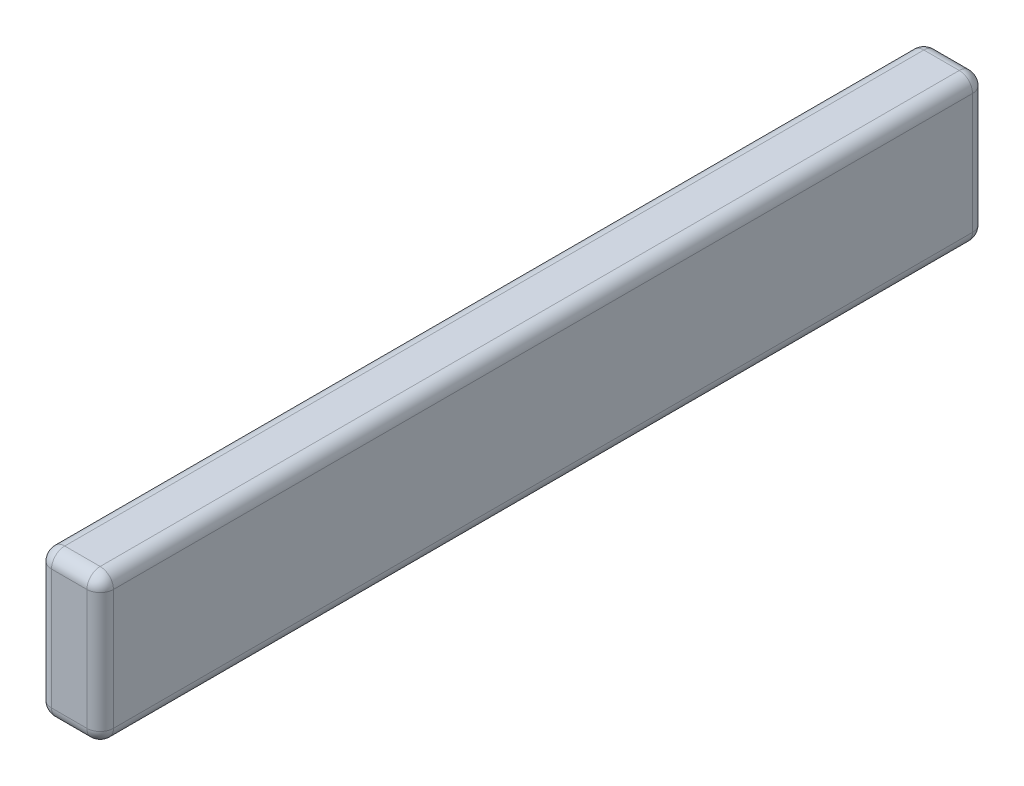
ISO-10303-21;
HEADER;
FILE_DESCRIPTION(('STEP AP214'),'2;1');
FILE_NAME('part.step','',(''),(''),'','','');
FILE_SCHEMA(('AUTOMOTIVE_DESIGN { 1 0 10303 214 1 1 1 1 }'));
ENDSEC;
DATA;
#1=APPLICATION_CONTEXT('core data for automotive mechanical design processes');
#2=APPLICATION_PROTOCOL_DEFINITION('international standard','automotive_design',2000,#1);
#3=PRODUCT_CONTEXT('',#1,'mechanical');
#4=PRODUCT('Part','Part','',(#3));
#5=PRODUCT_RELATED_PRODUCT_CATEGORY('part','',(#4));
#6=PRODUCT_DEFINITION_FORMATION('','',#4);
#7=PRODUCT_DEFINITION_CONTEXT('part definition',#1,'design');
#8=PRODUCT_DEFINITION('design','',#6,#7);
#9=PRODUCT_DEFINITION_SHAPE('','',#8);
#10=(LENGTH_UNIT() NAMED_UNIT(*) SI_UNIT(.MILLI.,.METRE.));
#11=(NAMED_UNIT(*) PLANE_ANGLE_UNIT() SI_UNIT($,.RADIAN.));
#12=(NAMED_UNIT(*) SI_UNIT($,.STERADIAN.) SOLID_ANGLE_UNIT());
#13=UNCERTAINTY_MEASURE_WITH_UNIT(LENGTH_MEASURE(1.E-05),#10,'distance_accuracy_value','');
#14=(GEOMETRIC_REPRESENTATION_CONTEXT(3) GLOBAL_UNCERTAINTY_ASSIGNED_CONTEXT((#13)) GLOBAL_UNIT_ASSIGNED_CONTEXT((#10,
#11,#12)) REPRESENTATION_CONTEXT('',''));
#15=CARTESIAN_POINT('',(0.,0.,0.));
#16=DIRECTION('',(0.,0.,1.));
#17=DIRECTION('',(1.,0.,0.));
#18=AXIS2_PLACEMENT_3D('',#15,#16,#17);
#19=CARTESIAN_POINT('',(140.,165.8,1000.));
#20=DIRECTION('',(0.,0.,-1.));
#21=DIRECTION('',(-1.,0.,0.));
#22=AXIS2_PLACEMENT_3D('',#19,#20,#21);
#23=PLANE('',#22);
#24=DIRECTION('',(-1.,0.,0.));
#25=VECTOR('',#24,1.);
#26=CARTESIAN_POINT('',(140.,135.8,1000.));
#27=LINE('',#26,#25);
#28=CARTESIAN_POINT('',(110.,135.8,1000.));
#29=VERTEX_POINT('',#28);
#30=CARTESIAN_POINT('',(30.,135.8,1000.));
#31=VERTEX_POINT('',#30);
#32=EDGE_CURVE('E166',#29,#31,#27,.T.);
#33=ORIENTED_EDGE('',*,*,#32,.T.);
#34=DIRECTION('',(0.,-1.,0.));
#35=VECTOR('',#34,1.);
#36=CARTESIAN_POINT('',(30.,-165.8,1000.));
#37=LINE('',#36,#35);
#38=CARTESIAN_POINT('',(30.,-135.8,1000.));
#39=VERTEX_POINT('',#38);
#40=EDGE_CURVE('E171',#31,#39,#37,.T.);
#41=ORIENTED_EDGE('',*,*,#40,.T.);
#42=DIRECTION('',(-1.,0.,0.));
#43=VECTOR('',#42,1.);
#44=CARTESIAN_POINT('',(140.,-135.8,1000.));
#45=LINE('',#44,#43);
#46=CARTESIAN_POINT('',(110.,-135.8,1000.));
#47=VERTEX_POINT('',#46);
#48=EDGE_CURVE('E168',#39,#47,#45,.F.);
#49=ORIENTED_EDGE('',*,*,#48,.T.);
#50=DIRECTION('',(0.,-1.,0.));
#51=VECTOR('',#50,1.);
#52=CARTESIAN_POINT('',(110.,165.8,1000.));
#53=LINE('',#52,#51);
#54=EDGE_CURVE('E164',#47,#29,#53,.F.);
#55=ORIENTED_EDGE('',*,*,#54,.T.);
#56=EDGE_LOOP('',(#33,#41,#49,#55));
#57=FACE_BOUND('',#56,.T.);
#58=ADVANCED_FACE('F33',(#57),#23,.F.);
#59=CARTESIAN_POINT('',(140.,-165.8,-1000.));
#60=DIRECTION('',(0.,1.,0.));
#61=DIRECTION('',(0.,0.,1.));
#62=AXIS2_PLACEMENT_3D('',#59,#60,#61);
#63=PLANE('',#62);
#64=DIRECTION('',(-1.,0.,0.));
#65=VECTOR('',#64,1.);
#66=CARTESIAN_POINT('',(140.,-165.8,970.));
#67=LINE('',#66,#65);
#68=CARTESIAN_POINT('',(110.,-165.8,970.));
#69=VERTEX_POINT('',#68);
#70=CARTESIAN_POINT('',(30.,-165.8,970.));
#71=VERTEX_POINT('',#70);
#72=EDGE_CURVE('E132',#69,#71,#67,.T.);
#73=ORIENTED_EDGE('',*,*,#72,.T.);
#74=DIRECTION('',(0.,0.,-1.));
#75=VECTOR('',#74,1.);
#76=CARTESIAN_POINT('',(30.,-165.8,-1000.));
#77=LINE('',#76,#75);
#78=CARTESIAN_POINT('',(30.,-165.8,-970.));
#79=VERTEX_POINT('',#78);
#80=EDGE_CURVE('E128',#71,#79,#77,.T.);
#81=ORIENTED_EDGE('',*,*,#80,.T.);
#82=DIRECTION('',(-1.,0.,0.));
#83=VECTOR('',#82,1.);
#84=CARTESIAN_POINT('',(140.,-165.8,-970.));
#85=LINE('',#84,#83);
#86=CARTESIAN_POINT('',(110.,-165.8,-970.));
#87=VERTEX_POINT('',#86);
#88=EDGE_CURVE('E120',#79,#87,#85,.F.);
#89=ORIENTED_EDGE('',*,*,#88,.T.);
#90=DIRECTION('',(0.,0.,-1.));
#91=VECTOR('',#90,1.);
#92=CARTESIAN_POINT('',(110.,-165.8,-1000.));
#93=LINE('',#92,#91);
#94=EDGE_CURVE('E125',#87,#69,#93,.F.);
#95=ORIENTED_EDGE('',*,*,#94,.T.);
#96=EDGE_LOOP('',(#73,#81,#89,#95));
#97=FACE_BOUND('',#96,.T.);
#98=ADVANCED_FACE('F123',(#97),#63,.F.);
#99=CARTESIAN_POINT('',(140.,165.8,-1000.));
#100=DIRECTION('',(0.,0.,1.));
#101=DIRECTION('',(1.,0.,0.));
#102=AXIS2_PLACEMENT_3D('',#99,#100,#101);
#103=PLANE('',#102);
#104=DIRECTION('',(-1.,0.,0.));
#105=VECTOR('',#104,1.);
#106=CARTESIAN_POINT('',(140.,-135.8,-1000.));
#107=LINE('',#106,#105);
#108=CARTESIAN_POINT('',(110.,-135.8,-1000.));
#109=VERTEX_POINT('',#108);
#110=CARTESIAN_POINT('',(30.,-135.8,-1000.));
#111=VERTEX_POINT('',#110);
#112=EDGE_CURVE('E140',#109,#111,#107,.T.);
#113=ORIENTED_EDGE('',*,*,#112,.T.);
#114=DIRECTION('',(0.,1.,0.));
#115=VECTOR('',#114,1.);
#116=CARTESIAN_POINT('',(30.,165.8,-1000.));
#117=LINE('',#116,#115);
#118=CARTESIAN_POINT('',(30.,135.8,-1000.));
#119=VERTEX_POINT('',#118);
#120=EDGE_CURVE('E178',#111,#119,#117,.T.);
#121=ORIENTED_EDGE('',*,*,#120,.T.);
#122=DIRECTION('',(-1.,0.,0.));
#123=VECTOR('',#122,1.);
#124=CARTESIAN_POINT('',(140.,135.8,-1000.));
#125=LINE('',#124,#123);
#126=CARTESIAN_POINT('',(110.,135.8,-1000.));
#127=VERTEX_POINT('',#126);
#128=EDGE_CURVE('E175',#119,#127,#125,.F.);
#129=ORIENTED_EDGE('',*,*,#128,.T.);
#130=DIRECTION('',(0.,1.,0.));
#131=VECTOR('',#130,1.);
#132=CARTESIAN_POINT('',(110.,165.8,-1000.));
#133=LINE('',#132,#131);
#134=EDGE_CURVE('E173',#127,#109,#133,.F.);
#135=ORIENTED_EDGE('',*,*,#134,.T.);
#136=EDGE_LOOP('',(#113,#121,#129,#135));
#137=FACE_BOUND('',#136,.T.);
#138=ADVANCED_FACE('F324',(#137),#103,.F.);
#139=CARTESIAN_POINT('',(140.,165.8,-1000.));
#140=DIRECTION('',(0.,-1.,0.));
#141=DIRECTION('',(0.,0.,-1.));
#142=AXIS2_PLACEMENT_3D('',#139,#140,#141);
#143=PLANE('',#142);
#144=DIRECTION('',(-1.,0.,0.));
#145=VECTOR('',#144,1.);
#146=CARTESIAN_POINT('',(140.,165.8,-970.));
#147=LINE('',#146,#145);
#148=CARTESIAN_POINT('',(110.,165.8,-970.));
#149=VERTEX_POINT('',#148);
#150=CARTESIAN_POINT('',(30.,165.8,-970.));
#151=VERTEX_POINT('',#150);
#152=EDGE_CURVE('E184',#149,#151,#147,.T.);
#153=ORIENTED_EDGE('',*,*,#152,.T.);
#154=DIRECTION('',(0.,0.,1.));
#155=VECTOR('',#154,1.);
#156=CARTESIAN_POINT('',(30.,165.8,1000.));
#157=LINE('',#156,#155);
#158=CARTESIAN_POINT('',(30.,165.8,970.));
#159=VERTEX_POINT('',#158);
#160=EDGE_CURVE('E187',#151,#159,#157,.T.);
#161=ORIENTED_EDGE('',*,*,#160,.T.);
#162=DIRECTION('',(-1.,0.,0.));
#163=VECTOR('',#162,1.);
#164=CARTESIAN_POINT('',(140.,165.8,970.));
#165=LINE('',#164,#163);
#166=CARTESIAN_POINT('',(110.,165.8,970.));
#167=VERTEX_POINT('',#166);
#168=EDGE_CURVE('E182',#159,#167,#165,.F.);
#169=ORIENTED_EDGE('',*,*,#168,.T.);
#170=DIRECTION('',(0.,0.,1.));
#171=VECTOR('',#170,1.);
#172=CARTESIAN_POINT('',(110.,165.8,-1000.));
#173=LINE('',#172,#171);
#174=EDGE_CURVE('E180',#167,#149,#173,.F.);
#175=ORIENTED_EDGE('',*,*,#174,.T.);
#176=EDGE_LOOP('',(#153,#161,#169,#175));
#177=FACE_BOUND('',#176,.T.);
#178=ADVANCED_FACE('F273',(#177),#143,.F.);
#179=CARTESIAN_POINT('',(140.,0.,0.));
#180=DIRECTION('',(-1.,0.,0.));
#181=DIRECTION('',(0.,0.,1.));
#182=AXIS2_PLACEMENT_3D('',#179,#180,#181);
#183=PLANE('',#182);
#184=DIRECTION('',(0.,1.,0.));
#185=VECTOR('',#184,1.);
#186=CARTESIAN_POINT('',(140.,0.,-970.));
#187=LINE('',#186,#185);
#188=CARTESIAN_POINT('',(140.,-135.8,-970.));
#189=VERTEX_POINT('',#188);
#190=CARTESIAN_POINT('',(140.,135.8,-970.));
#191=VERTEX_POINT('',#190);
#192=EDGE_CURVE('E42',#189,#191,#187,.T.);
#193=ORIENTED_EDGE('',*,*,#192,.T.);
#194=DIRECTION('',(0.,0.,1.));
#195=VECTOR('',#194,1.);
#196=CARTESIAN_POINT('',(140.,135.8,0.));
#197=LINE('',#196,#195);
#198=CARTESIAN_POINT('',(140.,135.8,970.));
#199=VERTEX_POINT('',#198);
#200=EDGE_CURVE('E11',#191,#199,#197,.T.);
#201=ORIENTED_EDGE('',*,*,#200,.T.);
#202=DIRECTION('',(0.,-1.,0.));
#203=VECTOR('',#202,1.);
#204=CARTESIAN_POINT('',(140.,0.,970.));
#205=LINE('',#204,#203);
#206=CARTESIAN_POINT('',(140.,-135.8,970.));
#207=VERTEX_POINT('',#206);
#208=EDGE_CURVE('E198',#199,#207,#205,.T.);
#209=ORIENTED_EDGE('',*,*,#208,.T.);
#210=DIRECTION('',(0.,0.,-1.));
#211=VECTOR('',#210,1.);
#212=CARTESIAN_POINT('',(140.,-135.8,0.));
#213=LINE('',#212,#211);
#214=EDGE_CURVE('E53',#207,#189,#213,.T.);
#215=ORIENTED_EDGE('',*,*,#214,.T.);
#216=EDGE_LOOP('',(#193,#201,#209,#215));
#217=FACE_BOUND('',#216,.T.);
#218=ADVANCED_FACE('F288',(#217),#183,.F.);
#219=CARTESIAN_POINT('',(0.,0.,0.));
#220=DIRECTION('',(-1.,0.,0.));
#221=DIRECTION('',(0.,0.,1.));
#222=AXIS2_PLACEMENT_3D('',#219,#220,#221);
#223=PLANE('',#222);
#224=DIRECTION('',(0.,1.,0.));
#225=VECTOR('',#224,1.);
#226=CARTESIAN_POINT('',(0.,-165.8,-970.));
#227=LINE('',#226,#225);
#228=CARTESIAN_POINT('',(0.,135.8,-970.));
#229=VERTEX_POINT('',#228);
#230=CARTESIAN_POINT('',(0.,-135.8,-970.));
#231=VERTEX_POINT('',#230);
#232=EDGE_CURVE('E193',#229,#231,#227,.F.);
#233=ORIENTED_EDGE('',*,*,#232,.T.);
#234=DIRECTION('',(0.,0.,-1.));
#235=VECTOR('',#234,1.);
#236=CARTESIAN_POINT('',(0.,-135.8,1000.));
#237=LINE('',#236,#235);
#238=CARTESIAN_POINT('',(0.,-135.8,970.));
#239=VERTEX_POINT('',#238);
#240=EDGE_CURVE('E195',#231,#239,#237,.F.);
#241=ORIENTED_EDGE('',*,*,#240,.T.);
#242=DIRECTION('',(0.,-1.,0.));
#243=VECTOR('',#242,1.);
#244=CARTESIAN_POINT('',(0.,165.8,970.));
#245=LINE('',#244,#243);
#246=CARTESIAN_POINT('',(0.,135.8,970.));
#247=VERTEX_POINT('',#246);
#248=EDGE_CURVE('E189',#239,#247,#245,.F.);
#249=ORIENTED_EDGE('',*,*,#248,.T.);
#250=DIRECTION('',(0.,0.,1.));
#251=VECTOR('',#250,1.);
#252=CARTESIAN_POINT('',(0.,135.8,-1000.));
#253=LINE('',#252,#251);
#254=EDGE_CURVE('E191',#247,#229,#253,.F.);
#255=ORIENTED_EDGE('',*,*,#254,.T.);
#256=EDGE_LOOP('',(#233,#241,#249,#255));
#257=FACE_BOUND('',#256,.T.);
#258=ADVANCED_FACE('F264',(#257),#223,.T.);
#259=CARTESIAN_POINT('',(140.,135.8,-970.));
#260=DIRECTION('',(-1.,0.,0.));
#261=DIRECTION('',(0.,0.,1.));
#262=AXIS2_PLACEMENT_3D('',#259,#260,#261);
#263=CYLINDRICAL_SURFACE('',#262,30.);
#264=CARTESIAN_POINT('',(110.,135.8,-970.));
#265=DIRECTION('',(1.,0.,0.));
#266=DIRECTION('',(0.,0.,-1.));
#267=AXIS2_PLACEMENT_3D('',#264,#265,#266);
#268=CIRCLE('',#267,30.);
#269=EDGE_CURVE('E37',#127,#149,#268,.T.);
#270=ORIENTED_EDGE('',*,*,#269,.F.);
#271=ORIENTED_EDGE('',*,*,#128,.F.);
#272=CARTESIAN_POINT('',(30.,135.8,-970.));
#273=DIRECTION('',(-1.,0.,0.));
#274=DIRECTION('',(0.,0.,1.));
#275=AXIS2_PLACEMENT_3D('',#272,#273,#274);
#276=CIRCLE('',#275,30.);
#277=EDGE_CURVE('E160',#151,#119,#276,.T.);
#278=ORIENTED_EDGE('',*,*,#277,.F.);
#279=ORIENTED_EDGE('',*,*,#152,.F.);
#280=EDGE_LOOP('',(#270,#271,#278,#279));
#281=FACE_BOUND('',#280,.T.);
#282=ADVANCED_FACE('F35',(#281),#263,.T.);
#283=CARTESIAN_POINT('',(110.,135.8,-970.));
#284=DIRECTION('',(0.,0.,1.));
#285=DIRECTION('',(1.,0.,0.));
#286=AXIS2_PLACEMENT_3D('',#283,#284,#285);
#287=SPHERICAL_SURFACE('',#286,30.);
#288=CARTESIAN_POINT('',(110.,135.8,-970.));
#289=DIRECTION('',(0.,1.,0.));
#290=DIRECTION('',(0.,0.,1.));
#291=AXIS2_PLACEMENT_3D('',#288,#289,#290);
#292=CIRCLE('',#291,30.);
#293=EDGE_CURVE('E244',#127,#191,#292,.F.);
#294=ORIENTED_EDGE('',*,*,#293,.F.);
#295=ORIENTED_EDGE('',*,*,#269,.T.);
#296=CARTESIAN_POINT('',(110.,135.8,-970.));
#297=DIRECTION('',(0.,0.,-1.));
#298=DIRECTION('',(-1.,0.,0.));
#299=AXIS2_PLACEMENT_3D('',#296,#297,#298);
#300=CIRCLE('',#299,30.);
#301=EDGE_CURVE('E246',#191,#149,#300,.F.);
#302=ORIENTED_EDGE('',*,*,#301,.F.);
#303=EDGE_LOOP('',(#294,#295,#302));
#304=FACE_BOUND('',#303,.T.);
#305=ADVANCED_FACE('F457',(#304),#287,.T.);
#306=CARTESIAN_POINT('',(30.,135.8,-970.));
#307=DIRECTION('',(0.,0.,1.));
#308=DIRECTION('',(1.,0.,0.));
#309=AXIS2_PLACEMENT_3D('',#306,#307,#308);
#310=SPHERICAL_SURFACE('',#309,30.);
#311=CARTESIAN_POINT('',(30.,135.8,-970.));
#312=DIRECTION('',(0.,0.,-1.));
#313=DIRECTION('',(-1.,0.,0.));
#314=AXIS2_PLACEMENT_3D('',#311,#312,#313);
#315=CIRCLE('',#314,30.);
#316=EDGE_CURVE('E238',#151,#229,#315,.F.);
#317=ORIENTED_EDGE('',*,*,#316,.F.);
#318=ORIENTED_EDGE('',*,*,#277,.T.);
#319=CARTESIAN_POINT('',(30.,135.8,-970.));
#320=DIRECTION('',(0.,1.,0.));
#321=DIRECTION('',(0.,0.,1.));
#322=AXIS2_PLACEMENT_3D('',#319,#320,#321);
#323=CIRCLE('',#322,30.);
#324=EDGE_CURVE('E241',#229,#119,#323,.F.);
#325=ORIENTED_EDGE('',*,*,#324,.F.);
#326=EDGE_LOOP('',(#317,#318,#325));
#327=FACE_BOUND('',#326,.T.);
#328=ADVANCED_FACE('F253',(#327),#310,.T.);
#329=CARTESIAN_POINT('',(110.,135.8,0.));
#330=DIRECTION('',(0.,0.,1.));
#331=DIRECTION('',(0.,-1.,0.));
#332=AXIS2_PLACEMENT_3D('',#329,#330,#331);
#333=CYLINDRICAL_SURFACE('',#332,30.);
#334=ORIENTED_EDGE('',*,*,#301,.T.);
#335=ORIENTED_EDGE('',*,*,#174,.F.);
#336=CARTESIAN_POINT('',(110.,135.8,970.));
#337=DIRECTION('',(0.,0.,1.));
#338=DIRECTION('',(1.,0.,0.));
#339=AXIS2_PLACEMENT_3D('',#336,#337,#338);
#340=CIRCLE('',#339,30.);
#341=EDGE_CURVE('E232',#199,#167,#340,.T.);
#342=ORIENTED_EDGE('',*,*,#341,.F.);
#343=ORIENTED_EDGE('',*,*,#200,.F.);
#344=EDGE_LOOP('',(#334,#335,#342,#343));
#345=FACE_BOUND('',#344,.T.);
#346=ADVANCED_FACE('F287',(#345),#333,.T.);
#347=CARTESIAN_POINT('',(110.,0.,-970.));
#348=DIRECTION('',(0.,1.,0.));
#349=DIRECTION('',(0.,0.,1.));
#350=AXIS2_PLACEMENT_3D('',#347,#348,#349);
#351=CYLINDRICAL_SURFACE('',#350,30.);
#352=ORIENTED_EDGE('',*,*,#293,.T.);
#353=ORIENTED_EDGE('',*,*,#192,.F.);
#354=CARTESIAN_POINT('',(110.,-135.8,-970.));
#355=DIRECTION('',(0.,-1.,0.));
#356=DIRECTION('',(1.,0.,0.));
#357=AXIS2_PLACEMENT_3D('',#354,#355,#356);
#358=CIRCLE('',#357,30.);
#359=EDGE_CURVE('E144',#109,#189,#358,.T.);
#360=ORIENTED_EDGE('',*,*,#359,.F.);
#361=ORIENTED_EDGE('',*,*,#134,.F.);
#362=EDGE_LOOP('',(#352,#353,#360,#361));
#363=FACE_BOUND('',#362,.T.);
#364=ADVANCED_FACE('F434',(#363),#351,.T.);
#365=CARTESIAN_POINT('',(140.,-135.8,-970.));
#366=DIRECTION('',(-1.,0.,0.));
#367=DIRECTION('',(0.,0.,1.));
#368=AXIS2_PLACEMENT_3D('',#365,#366,#367);
#369=CYLINDRICAL_SURFACE('',#368,30.);
#370=CARTESIAN_POINT('',(30.,-135.8,-970.));
#371=DIRECTION('',(-1.,0.,0.));
#372=DIRECTION('',(0.,0.,1.));
#373=AXIS2_PLACEMENT_3D('',#370,#371,#372);
#374=CIRCLE('',#373,30.);
#375=EDGE_CURVE('E145',#111,#79,#374,.T.);
#376=ORIENTED_EDGE('',*,*,#375,.F.);
#377=ORIENTED_EDGE('',*,*,#112,.F.);
#378=CARTESIAN_POINT('',(110.,-135.8,-970.));
#379=DIRECTION('',(1.,0.,0.));
#380=DIRECTION('',(0.,0.,-1.));
#381=AXIS2_PLACEMENT_3D('',#378,#379,#380);
#382=CIRCLE('',#381,30.);
#383=EDGE_CURVE('E136',#87,#109,#382,.T.);
#384=ORIENTED_EDGE('',*,*,#383,.F.);
#385=ORIENTED_EDGE('',*,*,#88,.F.);
#386=EDGE_LOOP('',(#376,#377,#384,#385));
#387=FACE_BOUND('',#386,.T.);
#388=ADVANCED_FACE('F138',(#387),#369,.T.);
#389=CARTESIAN_POINT('',(30.,165.8,-970.));
#390=DIRECTION('',(0.,-1.,0.));
#391=DIRECTION('',(0.,0.,-1.));
#392=AXIS2_PLACEMENT_3D('',#389,#390,#391);
#393=CYLINDRICAL_SURFACE('',#392,30.);
#394=ORIENTED_EDGE('',*,*,#324,.T.);
#395=ORIENTED_EDGE('',*,*,#120,.F.);
#396=CARTESIAN_POINT('',(30.,-135.8,-970.));
#397=DIRECTION('',(0.,-1.,0.));
#398=DIRECTION('',(0.,0.,-1.));
#399=AXIS2_PLACEMENT_3D('',#396,#397,#398);
#400=CIRCLE('',#399,30.);
#401=EDGE_CURVE('E228',#231,#111,#400,.T.);
#402=ORIENTED_EDGE('',*,*,#401,.F.);
#403=ORIENTED_EDGE('',*,*,#232,.F.);
#404=EDGE_LOOP('',(#394,#395,#402,#403));
#405=FACE_BOUND('',#404,.T.);
#406=ADVANCED_FACE('F260',(#405),#393,.T.);
#407=CARTESIAN_POINT('',(30.,135.8,-1000.));
#408=DIRECTION('',(0.,0.,-1.));
#409=DIRECTION('',(0.,1.,0.));
#410=AXIS2_PLACEMENT_3D('',#407,#408,#409);
#411=CYLINDRICAL_SURFACE('',#410,30.);
#412=ORIENTED_EDGE('',*,*,#316,.T.);
#413=ORIENTED_EDGE('',*,*,#254,.F.);
#414=CARTESIAN_POINT('',(30.,135.8,970.));
#415=DIRECTION('',(0.,0.,1.));
#416=DIRECTION('',(1.,0.,0.));
#417=AXIS2_PLACEMENT_3D('',#414,#415,#416);
#418=CIRCLE('',#417,30.);
#419=EDGE_CURVE('E225',#159,#247,#418,.T.);
#420=ORIENTED_EDGE('',*,*,#419,.F.);
#421=ORIENTED_EDGE('',*,*,#160,.F.);
#422=EDGE_LOOP('',(#412,#413,#420,#421));
#423=FACE_BOUND('',#422,.T.);
#424=ADVANCED_FACE('F270',(#423),#411,.T.);
#425=CARTESIAN_POINT('',(140.,135.8,970.));
#426=DIRECTION('',(-1.,0.,0.));
#427=DIRECTION('',(0.,0.,1.));
#428=AXIS2_PLACEMENT_3D('',#425,#426,#427);
#429=CYLINDRICAL_SURFACE('',#428,30.);
#430=CARTESIAN_POINT('',(110.,135.8,970.));
#431=DIRECTION('',(1.,0.,0.));
#432=DIRECTION('',(0.,0.,-1.));
#433=AXIS2_PLACEMENT_3D('',#430,#431,#432);
#434=CIRCLE('',#433,30.);
#435=EDGE_CURVE('E235',#167,#29,#434,.T.);
#436=ORIENTED_EDGE('',*,*,#435,.F.);
#437=ORIENTED_EDGE('',*,*,#168,.F.);
#438=CARTESIAN_POINT('',(30.,135.8,970.));
#439=DIRECTION('',(-1.,0.,0.));
#440=DIRECTION('',(0.,0.,1.));
#441=AXIS2_PLACEMENT_3D('',#438,#439,#440);
#442=CIRCLE('',#441,30.);
#443=EDGE_CURVE('E222',#31,#159,#442,.T.);
#444=ORIENTED_EDGE('',*,*,#443,.F.);
#445=ORIENTED_EDGE('',*,*,#32,.F.);
#446=EDGE_LOOP('',(#436,#437,#444,#445));
#447=FACE_BOUND('',#446,.T.);
#448=ADVANCED_FACE('F278',(#447),#429,.T.);
#449=CARTESIAN_POINT('',(110.,135.8,970.));
#450=DIRECTION('',(0.,0.,1.));
#451=DIRECTION('',(1.,0.,0.));
#452=AXIS2_PLACEMENT_3D('',#449,#450,#451);
#453=SPHERICAL_SURFACE('',#452,30.);
#454=ORIENTED_EDGE('',*,*,#341,.T.);
#455=ORIENTED_EDGE('',*,*,#435,.T.);
#456=CARTESIAN_POINT('',(110.,135.8,970.));
#457=DIRECTION('',(0.,1.,0.));
#458=DIRECTION('',(0.,0.,1.));
#459=AXIS2_PLACEMENT_3D('',#456,#457,#458);
#460=CIRCLE('',#459,30.);
#461=EDGE_CURVE('E151',#199,#29,#460,.F.);
#462=ORIENTED_EDGE('',*,*,#461,.F.);
#463=EDGE_LOOP('',(#454,#455,#462));
#464=FACE_BOUND('',#463,.T.);
#465=ADVANCED_FACE('F284',(#464),#453,.T.);
#466=CARTESIAN_POINT('',(110.,-135.8,-970.));
#467=DIRECTION('',(0.,0.,1.));
#468=DIRECTION('',(1.,0.,0.));
#469=AXIS2_PLACEMENT_3D('',#466,#467,#468);
#470=SPHERICAL_SURFACE('',#469,30.);
#471=ORIENTED_EDGE('',*,*,#383,.T.);
#472=ORIENTED_EDGE('',*,*,#359,.T.);
#473=CARTESIAN_POINT('',(110.,-135.8,-970.));
#474=DIRECTION('',(0.,0.,-1.));
#475=DIRECTION('',(-1.,0.,0.));
#476=AXIS2_PLACEMENT_3D('',#473,#474,#475);
#477=CIRCLE('',#476,30.);
#478=EDGE_CURVE('E148',#87,#189,#477,.F.);
#479=ORIENTED_EDGE('',*,*,#478,.F.);
#480=EDGE_LOOP('',(#471,#472,#479));
#481=FACE_BOUND('',#480,.T.);
#482=ADVANCED_FACE('F149',(#481),#470,.T.);
#483=CARTESIAN_POINT('',(30.,-135.8,-970.));
#484=DIRECTION('',(0.,0.,1.));
#485=DIRECTION('',(1.,0.,0.));
#486=AXIS2_PLACEMENT_3D('',#483,#484,#485);
#487=SPHERICAL_SURFACE('',#486,30.);
#488=ORIENTED_EDGE('',*,*,#401,.T.);
#489=ORIENTED_EDGE('',*,*,#375,.T.);
#490=CARTESIAN_POINT('',(30.,-135.8,-970.));
#491=DIRECTION('',(0.,0.,-1.));
#492=DIRECTION('',(-1.,0.,0.));
#493=AXIS2_PLACEMENT_3D('',#490,#491,#492);
#494=CIRCLE('',#493,30.);
#495=EDGE_CURVE('E152',#231,#79,#494,.F.);
#496=ORIENTED_EDGE('',*,*,#495,.F.);
#497=EDGE_LOOP('',(#488,#489,#496));
#498=FACE_BOUND('',#497,.T.);
#499=ADVANCED_FACE('F307',(#498),#487,.T.);
#500=CARTESIAN_POINT('',(30.,135.8,970.));
#501=DIRECTION('',(0.,0.,1.));
#502=DIRECTION('',(1.,0.,0.));
#503=AXIS2_PLACEMENT_3D('',#500,#501,#502);
#504=SPHERICAL_SURFACE('',#503,30.);
#505=ORIENTED_EDGE('',*,*,#443,.T.);
#506=ORIENTED_EDGE('',*,*,#419,.T.);
#507=CARTESIAN_POINT('',(30.,135.8,970.));
#508=DIRECTION('',(0.,1.,0.));
#509=DIRECTION('',(0.,0.,1.));
#510=AXIS2_PLACEMENT_3D('',#507,#508,#509);
#511=CIRCLE('',#510,30.);
#512=EDGE_CURVE('E215',#31,#247,#511,.F.);
#513=ORIENTED_EDGE('',*,*,#512,.F.);
#514=EDGE_LOOP('',(#505,#506,#513));
#515=FACE_BOUND('',#514,.T.);
#516=ADVANCED_FACE('F309',(#515),#504,.T.);
#517=CARTESIAN_POINT('',(110.,0.,970.));
#518=DIRECTION('',(0.,-1.,0.));
#519=DIRECTION('',(0.,0.,-1.));
#520=AXIS2_PLACEMENT_3D('',#517,#518,#519);
#521=CYLINDRICAL_SURFACE('',#520,30.);
#522=ORIENTED_EDGE('',*,*,#461,.T.);
#523=ORIENTED_EDGE('',*,*,#54,.F.);
#524=CARTESIAN_POINT('',(110.,-135.8,970.));
#525=DIRECTION('',(0.,-1.,0.));
#526=DIRECTION('',(0.,0.,-1.));
#527=AXIS2_PLACEMENT_3D('',#524,#525,#526);
#528=CIRCLE('',#527,30.);
#529=EDGE_CURVE('E212',#207,#47,#528,.T.);
#530=ORIENTED_EDGE('',*,*,#529,.F.);
#531=ORIENTED_EDGE('',*,*,#208,.F.);
#532=EDGE_LOOP('',(#522,#523,#530,#531));
#533=FACE_BOUND('',#532,.T.);
#534=ADVANCED_FACE('F292',(#533),#521,.T.);
#535=CARTESIAN_POINT('',(110.,-135.8,0.));
#536=DIRECTION('',(0.,0.,-1.));
#537=DIRECTION('',(0.,1.,0.));
#538=AXIS2_PLACEMENT_3D('',#535,#536,#537);
#539=CYLINDRICAL_SURFACE('',#538,30.);
#540=ORIENTED_EDGE('',*,*,#478,.T.);
#541=ORIENTED_EDGE('',*,*,#214,.F.);
#542=CARTESIAN_POINT('',(110.,-135.8,970.));
#543=DIRECTION('',(0.,0.,1.));
#544=DIRECTION('',(1.,0.,0.));
#545=AXIS2_PLACEMENT_3D('',#542,#543,#544);
#546=CIRCLE('',#545,30.);
#547=EDGE_CURVE('E156',#69,#207,#546,.T.);
#548=ORIENTED_EDGE('',*,*,#547,.F.);
#549=ORIENTED_EDGE('',*,*,#94,.F.);
#550=EDGE_LOOP('',(#540,#541,#548,#549));
#551=FACE_BOUND('',#550,.T.);
#552=ADVANCED_FACE('F154',(#551),#539,.T.);
#553=CARTESIAN_POINT('',(30.,-135.8,-1000.));
#554=DIRECTION('',(0.,0.,1.));
#555=DIRECTION('',(0.,-1.,0.));
#556=AXIS2_PLACEMENT_3D('',#553,#554,#555);
#557=CYLINDRICAL_SURFACE('',#556,30.);
#558=ORIENTED_EDGE('',*,*,#495,.T.);
#559=ORIENTED_EDGE('',*,*,#80,.F.);
#560=CARTESIAN_POINT('',(30.,-135.8,970.));
#561=DIRECTION('',(0.,0.,1.));
#562=DIRECTION('',(0.,-1.,0.));
#563=AXIS2_PLACEMENT_3D('',#560,#561,#562);
#564=CIRCLE('',#563,30.);
#565=EDGE_CURVE('E208',#239,#71,#564,.T.);
#566=ORIENTED_EDGE('',*,*,#565,.F.);
#567=ORIENTED_EDGE('',*,*,#240,.F.);
#568=EDGE_LOOP('',(#558,#559,#566,#567));
#569=FACE_BOUND('',#568,.T.);
#570=ADVANCED_FACE('F305',(#569),#557,.T.);
#571=CARTESIAN_POINT('',(30.,165.8,970.));
#572=DIRECTION('',(0.,1.,0.));
#573=DIRECTION('',(0.,0.,1.));
#574=AXIS2_PLACEMENT_3D('',#571,#572,#573);
#575=CYLINDRICAL_SURFACE('',#574,30.);
#576=ORIENTED_EDGE('',*,*,#512,.T.);
#577=ORIENTED_EDGE('',*,*,#248,.F.);
#578=CARTESIAN_POINT('',(30.,-135.8,970.));
#579=DIRECTION('',(0.,-1.,0.));
#580=DIRECTION('',(0.,0.,-1.));
#581=AXIS2_PLACEMENT_3D('',#578,#579,#580);
#582=CIRCLE('',#581,30.);
#583=EDGE_CURVE('E206',#39,#239,#582,.T.);
#584=ORIENTED_EDGE('',*,*,#583,.F.);
#585=ORIENTED_EDGE('',*,*,#40,.F.);
#586=EDGE_LOOP('',(#576,#577,#584,#585));
#587=FACE_BOUND('',#586,.T.);
#588=ADVANCED_FACE('F334',(#587),#575,.T.);
#589=CARTESIAN_POINT('',(110.,-135.8,970.));
#590=DIRECTION('',(0.,0.,1.));
#591=DIRECTION('',(1.,0.,0.));
#592=AXIS2_PLACEMENT_3D('',#589,#590,#591);
#593=SPHERICAL_SURFACE('',#592,30.);
#594=ORIENTED_EDGE('',*,*,#547,.T.);
#595=ORIENTED_EDGE('',*,*,#529,.T.);
#596=CARTESIAN_POINT('',(110.,-135.8,970.));
#597=DIRECTION('',(1.,0.,0.));
#598=DIRECTION('',(0.,0.,-1.));
#599=AXIS2_PLACEMENT_3D('',#596,#597,#598);
#600=CIRCLE('',#599,30.);
#601=EDGE_CURVE('E204',#69,#47,#600,.F.);
#602=ORIENTED_EDGE('',*,*,#601,.F.);
#603=EDGE_LOOP('',(#594,#595,#602));
#604=FACE_BOUND('',#603,.T.);
#605=ADVANCED_FACE('F294',(#604),#593,.T.);
#606=CARTESIAN_POINT('',(30.,-135.8,970.));
#607=DIRECTION('',(0.,0.,1.));
#608=DIRECTION('',(1.,0.,0.));
#609=AXIS2_PLACEMENT_3D('',#606,#607,#608);
#610=SPHERICAL_SURFACE('',#609,30.);
#611=ORIENTED_EDGE('',*,*,#583,.T.);
#612=ORIENTED_EDGE('',*,*,#565,.T.);
#613=CARTESIAN_POINT('',(30.,-135.8,970.));
#614=DIRECTION('',(-1.,0.,0.));
#615=DIRECTION('',(0.,0.,1.));
#616=AXIS2_PLACEMENT_3D('',#613,#614,#615);
#617=CIRCLE('',#616,30.);
#618=EDGE_CURVE('E202',#39,#71,#617,.F.);
#619=ORIENTED_EDGE('',*,*,#618,.F.);
#620=EDGE_LOOP('',(#611,#612,#619));
#621=FACE_BOUND('',#620,.T.);
#622=ADVANCED_FACE('F302',(#621),#610,.T.);
#623=CARTESIAN_POINT('',(140.,-135.8,970.));
#624=DIRECTION('',(-1.,0.,0.));
#625=DIRECTION('',(0.,0.,1.));
#626=AXIS2_PLACEMENT_3D('',#623,#624,#625);
#627=CYLINDRICAL_SURFACE('',#626,30.);
#628=ORIENTED_EDGE('',*,*,#601,.T.);
#629=ORIENTED_EDGE('',*,*,#48,.F.);
#630=ORIENTED_EDGE('',*,*,#618,.T.);
#631=ORIENTED_EDGE('',*,*,#72,.F.);
#632=EDGE_LOOP('',(#628,#629,#630,#631));
#633=FACE_BOUND('',#632,.T.);
#634=ADVANCED_FACE('F298',(#633),#627,.T.);
#635=CLOSED_SHELL('',(#58,#98,#138,#178,#218,#258,#282,#305,#328,#346,#364,#388,#406,#424,#448,
#465,#482,#499,#516,#534,#552,#570,#588,#605,#622,#634));
#636=MANIFOLD_SOLID_BREP('B2',#635);
#637=ADVANCED_BREP_SHAPE_REPRESENTATION('',(#18,#636),#14);
#638=SHAPE_DEFINITION_REPRESENTATION(#9,#637);
ENDSEC;
END-ISO-10303-21;
